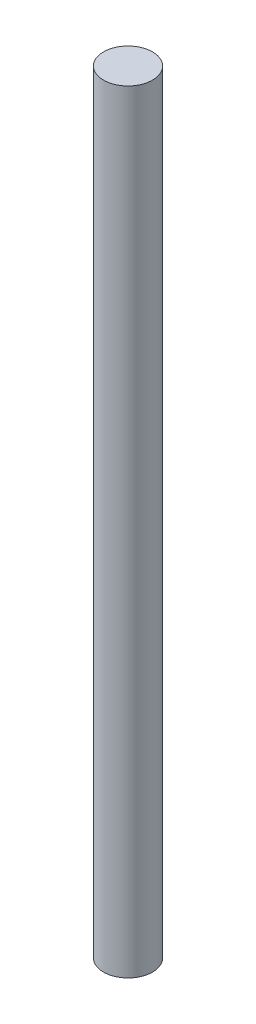
ISO-10303-21;
HEADER;
FILE_DESCRIPTION(('STEP AP214'),'2;1');
FILE_NAME('part.step','',(''),(''),'','','');
FILE_SCHEMA(('AUTOMOTIVE_DESIGN { 1 0 10303 214 1 1 1 1 }'));
ENDSEC;
DATA;
#1=APPLICATION_CONTEXT('core data for automotive mechanical design processes');
#2=APPLICATION_PROTOCOL_DEFINITION('international standard','automotive_design',2000,#1);
#3=PRODUCT_CONTEXT('',#1,'mechanical');
#4=PRODUCT('Part','Part','',(#3));
#5=PRODUCT_RELATED_PRODUCT_CATEGORY('part','',(#4));
#6=PRODUCT_DEFINITION_FORMATION('','',#4);
#7=PRODUCT_DEFINITION_CONTEXT('part definition',#1,'design');
#8=PRODUCT_DEFINITION('design','',#6,#7);
#9=PRODUCT_DEFINITION_SHAPE('','',#8);
#10=(LENGTH_UNIT() NAMED_UNIT(*) SI_UNIT(.MILLI.,.METRE.));
#11=(NAMED_UNIT(*) PLANE_ANGLE_UNIT() SI_UNIT($,.RADIAN.));
#12=(NAMED_UNIT(*) SI_UNIT($,.STERADIAN.) SOLID_ANGLE_UNIT());
#13=UNCERTAINTY_MEASURE_WITH_UNIT(LENGTH_MEASURE(1.E-05),#10,'distance_accuracy_value','');
#14=(GEOMETRIC_REPRESENTATION_CONTEXT(3) GLOBAL_UNCERTAINTY_ASSIGNED_CONTEXT((#13)) GLOBAL_UNIT_ASSIGNED_CONTEXT((#10,
#11,#12)) REPRESENTATION_CONTEXT('',''));
#15=CARTESIAN_POINT('',(0.,0.,0.));
#16=DIRECTION('',(0.,0.,1.));
#17=DIRECTION('',(1.,0.,0.));
#18=AXIS2_PLACEMENT_3D('',#15,#16,#17);
#19=CARTESIAN_POINT('',(0.,205.,0.));
#20=DIRECTION('',(0.,-1.,0.));
#21=DIRECTION('',(0.,0.,-1.));
#22=AXIS2_PLACEMENT_3D('',#19,#20,#21);
#23=CYLINDRICAL_SURFACE('',#22,6.5);
#24=CARTESIAN_POINT('',(0.,205.,0.));
#25=DIRECTION('',(0.,1.,0.));
#26=DIRECTION('',(0.,0.,1.));
#27=AXIS2_PLACEMENT_3D('',#24,#25,#26);
#28=CIRCLE('',#27,6.5);
#29=CARTESIAN_POINT('',(0.,205.,-6.5));
#30=VERTEX_POINT('',#29);
#31=EDGE_CURVE('E10',#30,#30,#28,.T.);
#32=CARTESIAN_POINT('',(0.,0.,0.));
#33=DIRECTION('',(0.,1.,0.));
#34=DIRECTION('',(0.,0.,1.));
#35=AXIS2_PLACEMENT_3D('',#32,#33,#34);
#36=CIRCLE('',#35,6.5);
#37=CARTESIAN_POINT('',(0.,0.,-6.5));
#38=VERTEX_POINT('',#37);
#39=EDGE_CURVE('E44',#38,#38,#36,.T.);
#40=CARTESIAN_POINT('',(0.,205.,-6.5));
#41=CARTESIAN_POINT('',(0.,202.864583333333,-6.5));
#42=CARTESIAN_POINT('',(0.,200.729166666667,-6.5));
#43=CARTESIAN_POINT('',(0.,196.458333333333,-6.5));
#44=CARTESIAN_POINT('',(0.,194.322916666667,-6.5));
#45=CARTESIAN_POINT('',(0.,190.052083333333,-6.5));
#46=CARTESIAN_POINT('',(0.,187.916666666667,-6.5));
#47=CARTESIAN_POINT('',(0.,183.645833333333,-6.5));
#48=CARTESIAN_POINT('',(0.,181.510416666667,-6.5));
#49=CARTESIAN_POINT('',(0.,177.239583333333,-6.5));
#50=CARTESIAN_POINT('',(0.,175.104166666667,-6.5));
#51=CARTESIAN_POINT('',(0.,170.833333333333,-6.5));
#52=CARTESIAN_POINT('',(0.,168.697916666667,-6.5));
#53=CARTESIAN_POINT('',(0.,164.427083333333,-6.5));
#54=CARTESIAN_POINT('',(0.,162.291666666667,-6.5));
#55=CARTESIAN_POINT('',(0.,158.020833333333,-6.5));
#56=CARTESIAN_POINT('',(0.,155.885416666667,-6.5));
#57=CARTESIAN_POINT('',(0.,151.614583333333,-6.5));
#58=CARTESIAN_POINT('',(0.,149.479166666667,-6.5));
#59=CARTESIAN_POINT('',(0.,145.208333333333,-6.5));
#60=CARTESIAN_POINT('',(0.,143.072916666667,-6.5));
#61=CARTESIAN_POINT('',(0.,138.802083333333,-6.5));
#62=CARTESIAN_POINT('',(0.,136.666666666667,-6.5));
#63=CARTESIAN_POINT('',(0.,132.395833333333,-6.5));
#64=CARTESIAN_POINT('',(0.,130.260416666667,-6.5));
#65=CARTESIAN_POINT('',(0.,125.989583333333,-6.5));
#66=CARTESIAN_POINT('',(0.,123.854166666667,-6.5));
#67=CARTESIAN_POINT('',(0.,119.583333333333,-6.5));
#68=CARTESIAN_POINT('',(0.,117.447916666667,-6.5));
#69=CARTESIAN_POINT('',(0.,113.177083333333,-6.5));
#70=CARTESIAN_POINT('',(0.,111.041666666667,-6.5));
#71=CARTESIAN_POINT('',(0.,106.770833333333,-6.5));
#72=CARTESIAN_POINT('',(0.,104.635416666667,-6.5));
#73=CARTESIAN_POINT('',(0.,100.364583333333,-6.5));
#74=CARTESIAN_POINT('',(0.,98.2291666666666,-6.5));
#75=CARTESIAN_POINT('',(0.,93.9583333333333,-6.5));
#76=CARTESIAN_POINT('',(0.,91.8229166666666,-6.5));
#77=CARTESIAN_POINT('',(0.,87.5520833333333,-6.5));
#78=CARTESIAN_POINT('',(0.,85.4166666666666,-6.5));
#79=CARTESIAN_POINT('',(0.,81.1458333333333,-6.5));
#80=CARTESIAN_POINT('',(0.,79.0104166666667,-6.5));
#81=CARTESIAN_POINT('',(0.,74.7395833333333,-6.5));
#82=CARTESIAN_POINT('',(0.,72.6041666666667,-6.5));
#83=CARTESIAN_POINT('',(0.,68.3333333333333,-6.5));
#84=CARTESIAN_POINT('',(0.,66.1979166666667,-6.5));
#85=CARTESIAN_POINT('',(0.,61.9270833333333,-6.5));
#86=CARTESIAN_POINT('',(0.,59.7916666666667,-6.5));
#87=CARTESIAN_POINT('',(0.,55.5208333333333,-6.5));
#88=CARTESIAN_POINT('',(0.,53.3854166666667,-6.5));
#89=CARTESIAN_POINT('',(0.,49.1145833333333,-6.5));
#90=CARTESIAN_POINT('',(0.,46.9791666666667,-6.5));
#91=CARTESIAN_POINT('',(0.,42.7083333333333,-6.5));
#92=CARTESIAN_POINT('',(0.,40.5729166666667,-6.5));
#93=CARTESIAN_POINT('',(0.,36.3020833333333,-6.5));
#94=CARTESIAN_POINT('',(0.,34.1666666666667,-6.5));
#95=CARTESIAN_POINT('',(0.,29.8958333333333,-6.5));
#96=CARTESIAN_POINT('',(0.,27.7604166666667,-6.5));
#97=CARTESIAN_POINT('',(0.,23.4895833333333,-6.5));
#98=CARTESIAN_POINT('',(0.,21.3541666666667,-6.5));
#99=CARTESIAN_POINT('',(0.,17.0833333333333,-6.5));
#100=CARTESIAN_POINT('',(0.,14.9479166666667,-6.5));
#101=CARTESIAN_POINT('',(0.,10.6770833333333,-6.5));
#102=CARTESIAN_POINT('',(0.,8.54166666666667,-6.5));
#103=CARTESIAN_POINT('',(0.,4.27083333333333,-6.5));
#104=CARTESIAN_POINT('',(0.,2.13541666666667,-6.5));
#105=CARTESIAN_POINT('',(0.,0.,-6.5));
#106=B_SPLINE_CURVE_WITH_KNOTS('',3,(#40,#41,#42,#43,#44,#45,#46,#47,#48,#49,#50,#51,#52,#53,
#54,#55,#56,#57,#58,#59,#60,#61,#62,#63,#64,#65,#66,#67,#68,#69,#70,#71,#72,#73,#74,#75,#76,#77,
#78,#79,#80,#81,#82,#83,#84,#85,#86,#87,#88,#89,#90,#91,#92,#93,#94,#95,#96,#97,#98,#99,#100,
#101,#102,#103,#104,#105),.UNSPECIFIED.,.F.,.F.,(4,2,2,2,2,2,2,2,2,2,2,2,2,2,2,2,2,2,2,2,2,2,2,
2,2,2,2,2,2,2,2,2,4),(0.,6.40625,12.8125,19.21875,25.625,32.03125,38.4375,44.84375,51.25,
57.65625,64.0625,70.46875,76.875,83.28125,89.6875,96.09375,102.5,108.90625,115.3125,121.71875,
128.125,134.53125,140.9375,147.34375,153.75,160.15625,166.5625,172.96875,179.375,185.78125,
192.1875,198.59375,205.),.UNSPECIFIED.);
#107=EDGE_CURVE('BSEAM41',#30,#38,#106,.T.);
#108=ORIENTED_EDGE('',*,*,#31,.F.);
#109=ORIENTED_EDGE('',*,*,#39,.T.);
#110=ORIENTED_EDGE('',*,*,#107,.T.);
#111=ORIENTED_EDGE('',*,*,#107,.F.);
#112=EDGE_LOOP('',(#108,#110,#109,#111));
#113=FACE_BOUND('',#112,.T.);
#114=ADVANCED_FACE('F41',(#113),#23,.T.);
#115=CARTESIAN_POINT('',(0.,205.,0.));
#116=DIRECTION('',(0.,1.,0.));
#117=DIRECTION('',(0.,0.,1.));
#118=AXIS2_PLACEMENT_3D('',#115,#116,#117);
#119=PLANE('',#118);
#120=ORIENTED_EDGE('',*,*,#31,.T.);
#121=EDGE_LOOP('',(#120));
#122=FACE_BOUND('',#121,.T.);
#123=ADVANCED_FACE('F58',(#122),#119,.T.);
#124=CARTESIAN_POINT('',(0.,0.,0.));
#125=DIRECTION('',(0.,1.,0.));
#126=DIRECTION('',(0.,0.,1.));
#127=AXIS2_PLACEMENT_3D('',#124,#125,#126);
#128=PLANE('',#127);
#129=ORIENTED_EDGE('',*,*,#39,.F.);
#130=EDGE_LOOP('',(#129));
#131=FACE_BOUND('',#130,.T.);
#132=ADVANCED_FACE('F56',(#131),#128,.F.);
#133=CLOSED_SHELL('',(#114,#123,#132));
#134=MANIFOLD_SOLID_BREP('B2',#133);
#135=ADVANCED_BREP_SHAPE_REPRESENTATION('',(#18,#134),#14);
#136=SHAPE_DEFINITION_REPRESENTATION(#9,#135);
ENDSEC;
END-ISO-10303-21;
